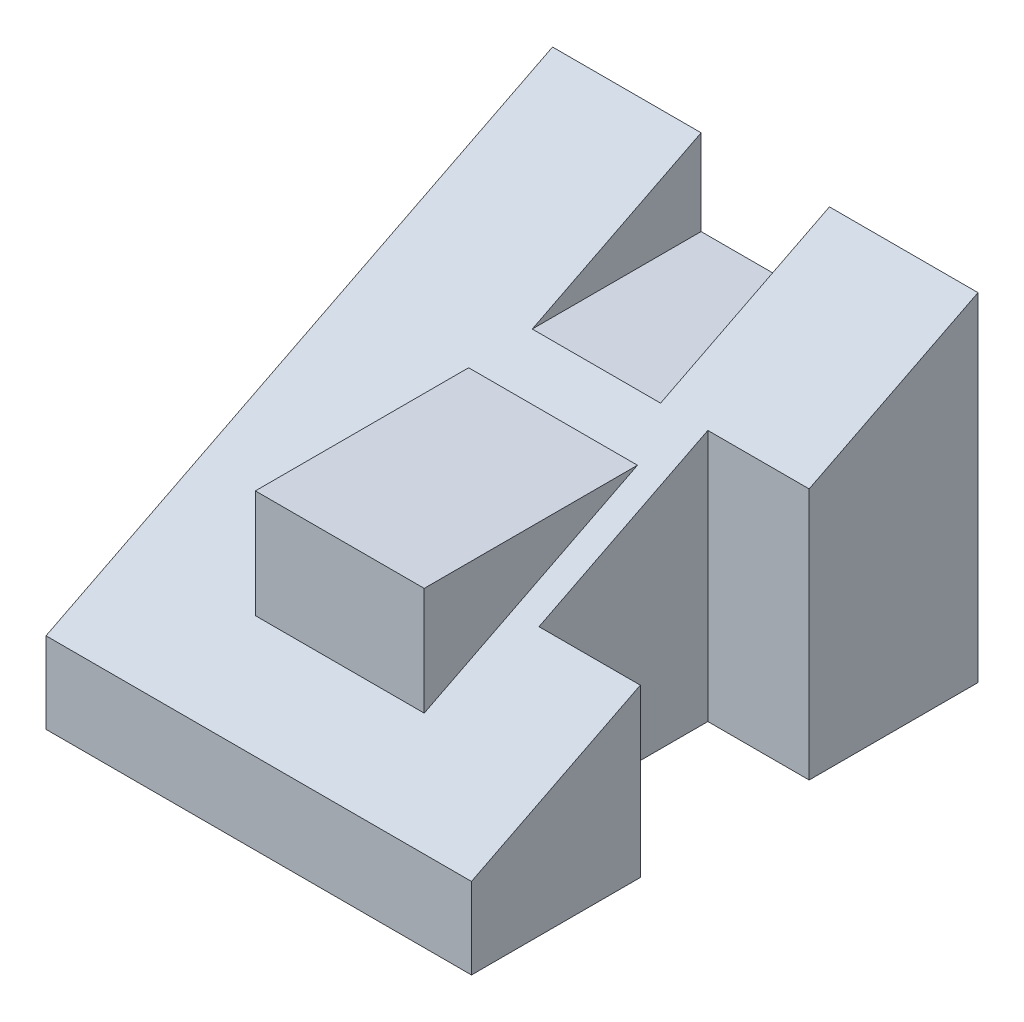
ISO-10303-21;
HEADER;
FILE_DESCRIPTION(('STEP AP214'),'2;1');
FILE_NAME('part.step','',(''),(''),'','','');
FILE_SCHEMA(('AUTOMOTIVE_DESIGN { 1 0 10303 214 1 1 1 1 }'));
ENDSEC;
DATA;
#1=APPLICATION_CONTEXT('core data for automotive mechanical design processes');
#2=APPLICATION_PROTOCOL_DEFINITION('international standard','automotive_design',2000,#1);
#3=PRODUCT_CONTEXT('',#1,'mechanical');
#4=PRODUCT('Part','Part','',(#3));
#5=PRODUCT_RELATED_PRODUCT_CATEGORY('part','',(#4));
#6=PRODUCT_DEFINITION_FORMATION('','',#4);
#7=PRODUCT_DEFINITION_CONTEXT('part definition',#1,'design');
#8=PRODUCT_DEFINITION('design','',#6,#7);
#9=PRODUCT_DEFINITION_SHAPE('','',#8);
#10=(LENGTH_UNIT() NAMED_UNIT(*) SI_UNIT(.MILLI.,.METRE.));
#11=(NAMED_UNIT(*) PLANE_ANGLE_UNIT() SI_UNIT($,.RADIAN.));
#12=(NAMED_UNIT(*) SI_UNIT($,.STERADIAN.) SOLID_ANGLE_UNIT());
#13=UNCERTAINTY_MEASURE_WITH_UNIT(LENGTH_MEASURE(1.E-05),#10,'distance_accuracy_value','');
#14=(GEOMETRIC_REPRESENTATION_CONTEXT(3) GLOBAL_UNCERTAINTY_ASSIGNED_CONTEXT((#13)) GLOBAL_UNIT_ASSIGNED_CONTEXT((#10,
#11,#12)) REPRESENTATION_CONTEXT('',''));
#15=CARTESIAN_POINT('',(0.,0.,0.));
#16=DIRECTION('',(0.,0.,1.));
#17=DIRECTION('',(1.,0.,0.));
#18=AXIS2_PLACEMENT_3D('',#15,#16,#17);
#19=CARTESIAN_POINT('',(-63.,50.,-75.));
#20=DIRECTION('',(0.,0.892035776030269,0.45196479318867));
#21=DIRECTION('',(0.,-0.45196479318867,0.892035776030269));
#22=AXIS2_PLACEMENT_3D('',#19,#20,#21);
#23=PLANE('',#22);
#24=DIRECTION('',(1.,0.,0.));
#25=VECTOR('',#24,1.);
#26=CARTESIAN_POINT('',(-44.,18.08,-12.));
#27=LINE('',#26,#25);
#28=CARTESIAN_POINT('',(-44.,18.08,-12.));
#29=VERTEX_POINT('',#28);
#30=CARTESIAN_POINT('',(-19.,18.08,-12.));
#31=VERTEX_POINT('',#30);
#32=EDGE_CURVE('E62',#29,#31,#27,.T.);
#33=ORIENTED_EDGE('',*,*,#32,.F.);
#34=DIRECTION('',(0.,0.451964793188669,-0.892035776030268));
#35=VECTOR('',#34,1.);
#36=CARTESIAN_POINT('',(-44.,18.08,-12.));
#37=LINE('',#36,#35);
#38=CARTESIAN_POINT('',(-44.,34.08,-43.578947368421));
#39=VERTEX_POINT('',#38);
#40=EDGE_CURVE('E224',#29,#39,#37,.T.);
#41=ORIENTED_EDGE('',*,*,#40,.T.);
#42=DIRECTION('',(1.,0.,0.));
#43=VECTOR('',#42,1.);
#44=CARTESIAN_POINT('',(-44.,34.08,-43.578947368421));
#45=LINE('',#44,#43);
#46=CARTESIAN_POINT('',(-19.,34.08,-43.578947368421));
#47=VERTEX_POINT('',#46);
#48=EDGE_CURVE('E215',#39,#47,#45,.T.);
#49=ORIENTED_EDGE('',*,*,#48,.T.);
#50=DIRECTION('',(0.,0.451964793188669,-0.892035776030268));
#51=VECTOR('',#50,1.);
#52=CARTESIAN_POINT('',(-19.,18.08,-12.));
#53=LINE('',#52,#51);
#54=EDGE_CURVE('E228',#31,#47,#53,.T.);
#55=ORIENTED_EDGE('',*,*,#54,.F.);
#56=EDGE_LOOP('',(#33,#41,#49,#55));
#57=FACE_BOUND('',#56,.T.);
#58=DIRECTION('',(1.,0.,0.));
#59=VECTOR('',#58,1.);
#60=CARTESIAN_POINT('',(-41.,37.3333333333333,-50.));
#61=LINE('',#60,#59);
#62=CARTESIAN_POINT('',(-41.,37.3333333333333,-50.));
#63=VERTEX_POINT('',#62);
#64=CARTESIAN_POINT('',(-22.,37.3333333333333,-50.));
#65=VERTEX_POINT('',#64);
#66=EDGE_CURVE('E156',#63,#65,#61,.T.);
#67=ORIENTED_EDGE('',*,*,#66,.F.);
#68=DIRECTION('',(0.,-0.45196479318867,0.892035776030268));
#69=VECTOR('',#68,1.);
#70=CARTESIAN_POINT('',(-41.,50.,-75.));
#71=LINE('',#70,#69);
#72=CARTESIAN_POINT('',(-41.,50.,-75.));
#73=VERTEX_POINT('',#72);
#74=EDGE_CURVE('E143',#73,#63,#71,.T.);
#75=ORIENTED_EDGE('',*,*,#74,.F.);
#76=DIRECTION('',(1.,0.,0.));
#77=VECTOR('',#76,1.);
#78=CARTESIAN_POINT('',(-63.,50.,-75.));
#79=LINE('',#78,#77);
#80=CARTESIAN_POINT('',(-63.,50.,-75.));
#81=VERTEX_POINT('',#80);
#82=EDGE_CURVE('E154',#81,#73,#79,.T.);
#83=ORIENTED_EDGE('',*,*,#82,.F.);
#84=DIRECTION('',(0.,-0.451964793188669,0.892035776030268));
#85=VECTOR('',#84,1.);
#86=CARTESIAN_POINT('',(-63.,50.,-75.));
#87=LINE('',#86,#85);
#88=CARTESIAN_POINT('',(-63.,12.,0.));
#89=VERTEX_POINT('',#88);
#90=EDGE_CURVE('E184',#81,#89,#87,.T.);
#91=ORIENTED_EDGE('',*,*,#90,.T.);
#92=DIRECTION('',(1.,0.,0.));
#93=VECTOR('',#92,1.);
#94=CARTESIAN_POINT('',(-63.,12.,0.));
#95=LINE('',#94,#93);
#96=CARTESIAN_POINT('',(0.,12.,0.));
#97=VERTEX_POINT('',#96);
#98=EDGE_CURVE('E46',#89,#97,#95,.T.);
#99=ORIENTED_EDGE('',*,*,#98,.T.);
#100=DIRECTION('',(0.,-0.451964793188669,0.892035776030268));
#101=VECTOR('',#100,1.);
#102=CARTESIAN_POINT('',(0.,50.,-75.));
#103=LINE('',#102,#101);
#104=CARTESIAN_POINT('',(0.,24.6666666666667,-25.));
#105=VERTEX_POINT('',#104);
#106=EDGE_CURVE('E173',#105,#97,#103,.T.);
#107=ORIENTED_EDGE('',*,*,#106,.F.);
#108=DIRECTION('',(1.,0.,0.));
#109=VECTOR('',#108,1.);
#110=CARTESIAN_POINT('',(-15.,24.6666666666667,-25.));
#111=LINE('',#110,#109);
#112=CARTESIAN_POINT('',(-15.,24.6666666666667,-25.));
#113=VERTEX_POINT('',#112);
#114=EDGE_CURVE('E198',#113,#105,#111,.T.);
#115=ORIENTED_EDGE('',*,*,#114,.F.);
#116=DIRECTION('',(0.,-0.45196479318867,0.892035776030269));
#117=VECTOR('',#116,1.);
#118=CARTESIAN_POINT('',(-15.,37.3333333333333,-50.));
#119=LINE('',#118,#117);
#120=CARTESIAN_POINT('',(-15.,37.3333333333333,-50.));
#121=VERTEX_POINT('',#120);
#122=EDGE_CURVE('E193',#121,#113,#119,.T.);
#123=ORIENTED_EDGE('',*,*,#122,.F.);
#124=DIRECTION('',(1.,0.,0.));
#125=VECTOR('',#124,1.);
#126=CARTESIAN_POINT('',(-15.,37.3333333333333,-50.));
#127=LINE('',#126,#125);
#128=CARTESIAN_POINT('',(0.,37.3333333333333,-50.));
#129=VERTEX_POINT('',#128);
#130=EDGE_CURVE('E195',#121,#129,#127,.T.);
#131=ORIENTED_EDGE('',*,*,#130,.T.);
#132=CARTESIAN_POINT('',(0.,50.,-75.));
#133=VERTEX_POINT('',#132);
#134=EDGE_CURVE('E170',#133,#129,#103,.T.);
#135=ORIENTED_EDGE('',*,*,#134,.F.);
#136=CARTESIAN_POINT('',(-22.,50.,-75.));
#137=VERTEX_POINT('',#136);
#138=EDGE_CURVE('E162',#137,#133,#79,.T.);
#139=ORIENTED_EDGE('',*,*,#138,.F.);
#140=DIRECTION('',(0.,-0.45196479318867,0.892035776030268));
#141=VECTOR('',#140,1.);
#142=CARTESIAN_POINT('',(-22.,50.,-75.));
#143=LINE('',#142,#141);
#144=EDGE_CURVE('E54',#137,#65,#143,.T.);
#145=ORIENTED_EDGE('',*,*,#144,.T.);
#146=EDGE_LOOP('',(#67,#75,#83,#91,#99,#107,#115,#123,#131,#135,#139,#145));
#147=FACE_BOUND('',#146,.T.);
#148=ADVANCED_FACE('F37',(#57,#147),#23,.T.);
#149=CARTESIAN_POINT('',(-63.,0.,-75.));
#150=DIRECTION('',(0.,0.,-1.));
#151=DIRECTION('',(-1.,0.,0.));
#152=AXIS2_PLACEMENT_3D('',#149,#150,#151);
#153=PLANE('',#152);
#154=ORIENTED_EDGE('',*,*,#82,.T.);
#155=DIRECTION('',(0.,1.,0.));
#156=VECTOR('',#155,1.);
#157=CARTESIAN_POINT('',(-41.,50.,-75.));
#158=LINE('',#157,#156);
#159=CARTESIAN_POINT('',(-41.,37.3333333333333,-75.));
#160=VERTEX_POINT('',#159);
#161=EDGE_CURVE('E140',#160,#73,#158,.T.);
#162=ORIENTED_EDGE('',*,*,#161,.F.);
#163=DIRECTION('',(1.,0.,0.));
#164=VECTOR('',#163,1.);
#165=CARTESIAN_POINT('',(-41.,37.3333333333333,-75.));
#166=LINE('',#165,#164);
#167=CARTESIAN_POINT('',(-22.,37.3333333333333,-75.));
#168=VERTEX_POINT('',#167);
#169=EDGE_CURVE('E231',#160,#168,#166,.T.);
#170=ORIENTED_EDGE('',*,*,#169,.T.);
#171=DIRECTION('',(0.,1.,0.));
#172=VECTOR('',#171,1.);
#173=CARTESIAN_POINT('',(-22.,50.,-75.));
#174=LINE('',#173,#172);
#175=EDGE_CURVE('E243',#168,#137,#174,.T.);
#176=ORIENTED_EDGE('',*,*,#175,.T.);
#177=ORIENTED_EDGE('',*,*,#138,.T.);
#178=DIRECTION('',(0.,1.,0.));
#179=VECTOR('',#178,1.);
#180=CARTESIAN_POINT('',(0.,0.,-75.));
#181=LINE('',#180,#179);
#182=CARTESIAN_POINT('',(0.,0.,-75.));
#183=VERTEX_POINT('',#182);
#184=EDGE_CURVE('E174',#183,#133,#181,.T.);
#185=ORIENTED_EDGE('',*,*,#184,.F.);
#186=DIRECTION('',(1.,0.,0.));
#187=VECTOR('',#186,1.);
#188=CARTESIAN_POINT('',(-63.,0.,-75.));
#189=LINE('',#188,#187);
#190=CARTESIAN_POINT('',(-63.,0.,-75.));
#191=VERTEX_POINT('',#190);
#192=EDGE_CURVE('E41',#191,#183,#189,.T.);
#193=ORIENTED_EDGE('',*,*,#192,.F.);
#194=DIRECTION('',(0.,1.,0.));
#195=VECTOR('',#194,1.);
#196=CARTESIAN_POINT('',(-63.,0.,-75.));
#197=LINE('',#196,#195);
#198=EDGE_CURVE('E161',#191,#81,#197,.T.);
#199=ORIENTED_EDGE('',*,*,#198,.T.);
#200=EDGE_LOOP('',(#154,#162,#170,#176,#177,#185,#193,#199));
#201=FACE_BOUND('',#200,.T.);
#202=ADVANCED_FACE('F159',(#201),#153,.T.);
#203=CARTESIAN_POINT('',(0.,0.,0.));
#204=DIRECTION('',(1.,0.,0.));
#205=DIRECTION('',(0.,0.,-1.));
#206=AXIS2_PLACEMENT_3D('',#203,#204,#205);
#207=PLANE('',#206);
#208=DIRECTION('',(0.,-1.,0.));
#209=VECTOR('',#208,1.);
#210=CARTESIAN_POINT('',(0.,24.6666666666667,-25.));
#211=LINE('',#210,#209);
#212=CARTESIAN_POINT('',(0.,0.,-25.));
#213=VERTEX_POINT('',#212);
#214=EDGE_CURVE('E203',#105,#213,#211,.T.);
#215=ORIENTED_EDGE('',*,*,#214,.F.);
#216=ORIENTED_EDGE('',*,*,#106,.T.);
#217=DIRECTION('',(0.,-1.,0.));
#218=VECTOR('',#217,1.);
#219=CARTESIAN_POINT('',(0.,12.,0.));
#220=LINE('',#219,#218);
#221=CARTESIAN_POINT('',(0.,0.,0.));
#222=VERTEX_POINT('',#221);
#223=EDGE_CURVE('E166',#97,#222,#220,.T.);
#224=ORIENTED_EDGE('',*,*,#223,.T.);
#225=DIRECTION('',(0.,0.,-1.));
#226=VECTOR('',#225,1.);
#227=CARTESIAN_POINT('',(0.,0.,0.));
#228=LINE('',#227,#226);
#229=EDGE_CURVE('E177',#222,#213,#228,.T.);
#230=ORIENTED_EDGE('',*,*,#229,.T.);
#231=EDGE_LOOP('',(#215,#216,#224,#230));
#232=FACE_BOUND('',#231,.T.);
#233=ADVANCED_FACE('F267',(#232),#207,.T.);
#234=CARTESIAN_POINT('',(-63.,0.,0.));
#235=DIRECTION('',(0.,-1.,0.));
#236=DIRECTION('',(0.,0.,-1.));
#237=AXIS2_PLACEMENT_3D('',#234,#235,#236);
#238=PLANE('',#237);
#239=DIRECTION('',(1.,0.,0.));
#240=VECTOR('',#239,1.);
#241=CARTESIAN_POINT('',(-15.,0.,-25.));
#242=LINE('',#241,#240);
#243=CARTESIAN_POINT('',(-15.,0.,-25.));
#244=VERTEX_POINT('',#243);
#245=EDGE_CURVE('E189',#244,#213,#242,.T.);
#246=ORIENTED_EDGE('',*,*,#245,.T.);
#247=ORIENTED_EDGE('',*,*,#229,.F.);
#248=DIRECTION('',(1.,0.,0.));
#249=VECTOR('',#248,1.);
#250=CARTESIAN_POINT('',(-63.,0.,0.));
#251=LINE('',#250,#249);
#252=CARTESIAN_POINT('',(-63.,0.,0.));
#253=VERTEX_POINT('',#252);
#254=EDGE_CURVE('E11',#253,#222,#251,.T.);
#255=ORIENTED_EDGE('',*,*,#254,.F.);
#256=DIRECTION('',(0.,0.,-1.));
#257=VECTOR('',#256,1.);
#258=CARTESIAN_POINT('',(-63.,0.,0.));
#259=LINE('',#258,#257);
#260=EDGE_CURVE('E169',#253,#191,#259,.T.);
#261=ORIENTED_EDGE('',*,*,#260,.T.);
#262=ORIENTED_EDGE('',*,*,#192,.T.);
#263=CARTESIAN_POINT('',(0.,0.,-50.));
#264=VERTEX_POINT('',#263);
#265=EDGE_CURVE('E180',#264,#183,#228,.T.);
#266=ORIENTED_EDGE('',*,*,#265,.F.);
#267=DIRECTION('',(1.,0.,0.));
#268=VECTOR('',#267,1.);
#269=CARTESIAN_POINT('',(-15.,0.,-50.));
#270=LINE('',#269,#268);
#271=CARTESIAN_POINT('',(-15.,0.,-50.));
#272=VERTEX_POINT('',#271);
#273=EDGE_CURVE('E192',#272,#264,#270,.T.);
#274=ORIENTED_EDGE('',*,*,#273,.F.);
#275=DIRECTION('',(0.,0.,-1.));
#276=VECTOR('',#275,1.);
#277=CARTESIAN_POINT('',(-15.,0.,-25.));
#278=LINE('',#277,#276);
#279=EDGE_CURVE('E210',#244,#272,#278,.T.);
#280=ORIENTED_EDGE('',*,*,#279,.F.);
#281=EDGE_LOOP('',(#246,#247,#255,#261,#262,#266,#274,#280));
#282=FACE_BOUND('',#281,.T.);
#283=ADVANCED_FACE('F39',(#282),#238,.T.);
#284=CARTESIAN_POINT('',(-63.,12.,0.));
#285=DIRECTION('',(0.,0.,1.));
#286=DIRECTION('',(0.,-1.,0.));
#287=AXIS2_PLACEMENT_3D('',#284,#285,#286);
#288=PLANE('',#287);
#289=ORIENTED_EDGE('',*,*,#223,.F.);
#290=ORIENTED_EDGE('',*,*,#98,.F.);
#291=DIRECTION('',(0.,-1.,0.));
#292=VECTOR('',#291,1.);
#293=CARTESIAN_POINT('',(-63.,12.,0.));
#294=LINE('',#293,#292);
#295=EDGE_CURVE('E181',#89,#253,#294,.T.);
#296=ORIENTED_EDGE('',*,*,#295,.T.);
#297=ORIENTED_EDGE('',*,*,#254,.T.);
#298=EDGE_LOOP('',(#289,#290,#296,#297));
#299=FACE_BOUND('',#298,.T.);
#300=ADVANCED_FACE('F262',(#299),#288,.T.);
#301=CARTESIAN_POINT('',(-63.,0.,0.));
#302=DIRECTION('',(1.,0.,0.));
#303=DIRECTION('',(0.,0.,-1.));
#304=AXIS2_PLACEMENT_3D('',#301,#302,#303);
#305=PLANE('',#304);
#306=ORIENTED_EDGE('',*,*,#260,.F.);
#307=ORIENTED_EDGE('',*,*,#295,.F.);
#308=ORIENTED_EDGE('',*,*,#90,.F.);
#309=ORIENTED_EDGE('',*,*,#198,.F.);
#310=EDGE_LOOP('',(#306,#307,#308,#309));
#311=FACE_BOUND('',#310,.T.);
#312=ADVANCED_FACE('F257',(#311),#305,.F.);
#313=DIRECTION('',(0.,1.,0.));
#314=VECTOR('',#313,1.);
#315=CARTESIAN_POINT('',(0.,0.,-50.));
#316=LINE('',#315,#314);
#317=EDGE_CURVE('E200',#264,#129,#316,.T.);
#318=ORIENTED_EDGE('',*,*,#317,.F.);
#319=ORIENTED_EDGE('',*,*,#265,.T.);
#320=ORIENTED_EDGE('',*,*,#184,.T.);
#321=ORIENTED_EDGE('',*,*,#134,.T.);
#322=EDGE_LOOP('',(#318,#319,#320,#321));
#323=FACE_BOUND('',#322,.T.);
#324=ADVANCED_FACE('F251',(#323),#207,.T.);
#325=CARTESIAN_POINT('',(-15.,24.6666666666667,-25.));
#326=DIRECTION('',(0.,0.,1.));
#327=DIRECTION('',(0.,-1.,0.));
#328=AXIS2_PLACEMENT_3D('',#325,#326,#327);
#329=PLANE('',#328);
#330=ORIENTED_EDGE('',*,*,#214,.T.);
#331=ORIENTED_EDGE('',*,*,#245,.F.);
#332=DIRECTION('',(0.,-1.,0.));
#333=VECTOR('',#332,1.);
#334=CARTESIAN_POINT('',(-15.,24.6666666666667,-25.));
#335=LINE('',#334,#333);
#336=EDGE_CURVE('E202',#113,#244,#335,.T.);
#337=ORIENTED_EDGE('',*,*,#336,.F.);
#338=ORIENTED_EDGE('',*,*,#114,.T.);
#339=EDGE_LOOP('',(#330,#331,#337,#338));
#340=FACE_BOUND('',#339,.T.);
#341=ADVANCED_FACE('F269',(#340),#329,.F.);
#342=CARTESIAN_POINT('',(-15.,0.,-50.));
#343=DIRECTION('',(0.,0.,-1.));
#344=DIRECTION('',(-1.,0.,0.));
#345=AXIS2_PLACEMENT_3D('',#342,#343,#344);
#346=PLANE('',#345);
#347=ORIENTED_EDGE('',*,*,#317,.T.);
#348=ORIENTED_EDGE('',*,*,#130,.F.);
#349=DIRECTION('',(0.,1.,0.));
#350=VECTOR('',#349,1.);
#351=CARTESIAN_POINT('',(-15.,0.,-50.));
#352=LINE('',#351,#350);
#353=EDGE_CURVE('E207',#272,#121,#352,.T.);
#354=ORIENTED_EDGE('',*,*,#353,.F.);
#355=ORIENTED_EDGE('',*,*,#273,.T.);
#356=EDGE_LOOP('',(#347,#348,#354,#355));
#357=FACE_BOUND('',#356,.T.);
#358=ADVANCED_FACE('F275',(#357),#346,.F.);
#359=CARTESIAN_POINT('',(-15.,0.,0.));
#360=DIRECTION('',(1.,0.,0.));
#361=DIRECTION('',(0.,0.,-1.));
#362=AXIS2_PLACEMENT_3D('',#359,#360,#361);
#363=PLANE('',#362);
#364=ORIENTED_EDGE('',*,*,#336,.T.);
#365=ORIENTED_EDGE('',*,*,#279,.T.);
#366=ORIENTED_EDGE('',*,*,#353,.T.);
#367=ORIENTED_EDGE('',*,*,#122,.T.);
#368=EDGE_LOOP('',(#364,#365,#366,#367));
#369=FACE_BOUND('',#368,.T.);
#370=ADVANCED_FACE('F273',(#369),#363,.T.);
#371=CARTESIAN_POINT('',(-44.,18.08,-12.));
#372=DIRECTION('',(0.,0.,1.));
#373=DIRECTION('',(1.,0.,0.));
#374=AXIS2_PLACEMENT_3D('',#371,#372,#373);
#375=PLANE('',#374);
#376=DIRECTION('',(0.,-1.,0.));
#377=VECTOR('',#376,1.);
#378=CARTESIAN_POINT('',(-19.,18.08,-12.));
#379=LINE('',#378,#377);
#380=CARTESIAN_POINT('',(-19.,34.08,-12.));
#381=VERTEX_POINT('',#380);
#382=EDGE_CURVE('E221',#381,#31,#379,.T.);
#383=ORIENTED_EDGE('',*,*,#382,.F.);
#384=DIRECTION('',(1.,0.,0.));
#385=VECTOR('',#384,1.);
#386=CARTESIAN_POINT('',(-44.,34.08,-12.));
#387=LINE('',#386,#385);
#388=CARTESIAN_POINT('',(-44.,34.08,-12.));
#389=VERTEX_POINT('',#388);
#390=EDGE_CURVE('E217',#389,#381,#387,.T.);
#391=ORIENTED_EDGE('',*,*,#390,.F.);
#392=DIRECTION('',(0.,-1.,0.));
#393=VECTOR('',#392,1.);
#394=CARTESIAN_POINT('',(-44.,18.08,-12.));
#395=LINE('',#394,#393);
#396=EDGE_CURVE('E218',#389,#29,#395,.T.);
#397=ORIENTED_EDGE('',*,*,#396,.T.);
#398=ORIENTED_EDGE('',*,*,#32,.T.);
#399=EDGE_LOOP('',(#383,#391,#397,#398));
#400=FACE_BOUND('',#399,.T.);
#401=ADVANCED_FACE('F282',(#400),#375,.T.);
#402=CARTESIAN_POINT('',(-44.,34.08,-12.));
#403=DIRECTION('',(0.,1.,0.));
#404=DIRECTION('',(0.,0.,1.));
#405=AXIS2_PLACEMENT_3D('',#402,#403,#404);
#406=PLANE('',#405);
#407=DIRECTION('',(0.,0.,1.));
#408=VECTOR('',#407,1.);
#409=CARTESIAN_POINT('',(-19.,34.08,-12.));
#410=LINE('',#409,#408);
#411=EDGE_CURVE('E225',#47,#381,#410,.T.);
#412=ORIENTED_EDGE('',*,*,#411,.F.);
#413=ORIENTED_EDGE('',*,*,#48,.F.);
#414=DIRECTION('',(0.,0.,1.));
#415=VECTOR('',#414,1.);
#416=CARTESIAN_POINT('',(-44.,34.08,-12.));
#417=LINE('',#416,#415);
#418=EDGE_CURVE('E234',#39,#389,#417,.T.);
#419=ORIENTED_EDGE('',*,*,#418,.T.);
#420=ORIENTED_EDGE('',*,*,#390,.T.);
#421=EDGE_LOOP('',(#412,#413,#419,#420));
#422=FACE_BOUND('',#421,.T.);
#423=ADVANCED_FACE('F334',(#422),#406,.T.);
#424=CARTESIAN_POINT('',(-44.,0.,0.));
#425=DIRECTION('',(1.,0.,0.));
#426=DIRECTION('',(0.,0.,-1.));
#427=AXIS2_PLACEMENT_3D('',#424,#425,#426);
#428=PLANE('',#427);
#429=ORIENTED_EDGE('',*,*,#40,.F.);
#430=ORIENTED_EDGE('',*,*,#396,.F.);
#431=ORIENTED_EDGE('',*,*,#418,.F.);
#432=EDGE_LOOP('',(#429,#430,#431));
#433=FACE_BOUND('',#432,.T.);
#434=ADVANCED_FACE('F345',(#433),#428,.F.);
#435=CARTESIAN_POINT('',(-19.,0.,0.));
#436=DIRECTION('',(1.,0.,0.));
#437=DIRECTION('',(0.,0.,-1.));
#438=AXIS2_PLACEMENT_3D('',#435,#436,#437);
#439=PLANE('',#438);
#440=ORIENTED_EDGE('',*,*,#54,.T.);
#441=ORIENTED_EDGE('',*,*,#411,.T.);
#442=ORIENTED_EDGE('',*,*,#382,.T.);
#443=EDGE_LOOP('',(#440,#441,#442));
#444=FACE_BOUND('',#443,.T.);
#445=ADVANCED_FACE('F356',(#444),#439,.T.);
#446=CARTESIAN_POINT('',(-41.,37.3333333333333,-50.));
#447=DIRECTION('',(0.,-1.,0.));
#448=DIRECTION('',(0.,0.,-1.));
#449=AXIS2_PLACEMENT_3D('',#446,#447,#448);
#450=PLANE('',#449);
#451=DIRECTION('',(0.,0.,-1.));
#452=VECTOR('',#451,1.);
#453=CARTESIAN_POINT('',(-22.,37.3333333333333,-50.));
#454=LINE('',#453,#452);
#455=EDGE_CURVE('E149',#65,#168,#454,.T.);
#456=ORIENTED_EDGE('',*,*,#455,.T.);
#457=ORIENTED_EDGE('',*,*,#169,.F.);
#458=DIRECTION('',(0.,0.,-1.));
#459=VECTOR('',#458,1.);
#460=CARTESIAN_POINT('',(-41.,37.3333333333333,-50.));
#461=LINE('',#460,#459);
#462=EDGE_CURVE('E145',#63,#160,#461,.T.);
#463=ORIENTED_EDGE('',*,*,#462,.F.);
#464=ORIENTED_EDGE('',*,*,#66,.T.);
#465=EDGE_LOOP('',(#456,#457,#463,#464));
#466=FACE_BOUND('',#465,.T.);
#467=ADVANCED_FACE('F366',(#466),#450,.F.);
#468=CARTESIAN_POINT('',(-41.,0.,0.));
#469=DIRECTION('',(1.,0.,0.));
#470=DIRECTION('',(0.,0.,-1.));
#471=AXIS2_PLACEMENT_3D('',#468,#469,#470);
#472=PLANE('',#471);
#473=ORIENTED_EDGE('',*,*,#161,.T.);
#474=ORIENTED_EDGE('',*,*,#74,.T.);
#475=ORIENTED_EDGE('',*,*,#462,.T.);
#476=EDGE_LOOP('',(#473,#474,#475));
#477=FACE_BOUND('',#476,.T.);
#478=ADVANCED_FACE('F142',(#477),#472,.T.);
#479=CARTESIAN_POINT('',(-22.,0.,0.));
#480=DIRECTION('',(1.,0.,0.));
#481=DIRECTION('',(0.,0.,-1.));
#482=AXIS2_PLACEMENT_3D('',#479,#480,#481);
#483=PLANE('',#482);
#484=ORIENTED_EDGE('',*,*,#175,.F.);
#485=ORIENTED_EDGE('',*,*,#455,.F.);
#486=ORIENTED_EDGE('',*,*,#144,.F.);
#487=EDGE_LOOP('',(#484,#485,#486));
#488=FACE_BOUND('',#487,.T.);
#489=ADVANCED_FACE('F400',(#488),#483,.F.);
#490=CLOSED_SHELL('',(#148,#202,#233,#283,#300,#312,#324,#341,#358,#370,#401,#423,#434,#445,
#467,#478,#489));
#491=MANIFOLD_SOLID_BREP('B2',#490);
#492=ADVANCED_BREP_SHAPE_REPRESENTATION('',(#18,#491),#14);
#493=SHAPE_DEFINITION_REPRESENTATION(#9,#492);
ENDSEC;
END-ISO-10303-21;
